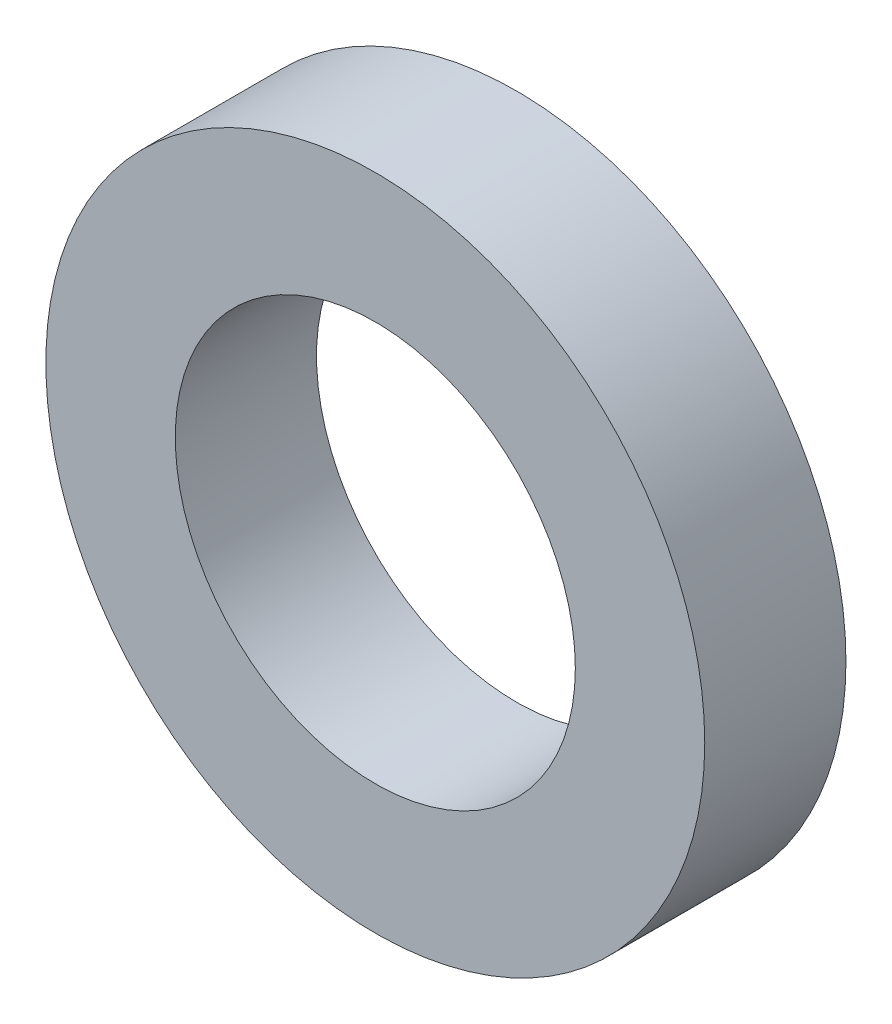
ISO-10303-21;
HEADER;
FILE_DESCRIPTION(('STEP AP214'),'2;1');
FILE_NAME('part.step','',(''),(''),'','','');
FILE_SCHEMA(('AUTOMOTIVE_DESIGN { 1 0 10303 214 1 1 1 1 }'));
ENDSEC;
DATA;
#1=APPLICATION_CONTEXT('core data for automotive mechanical design processes');
#2=APPLICATION_PROTOCOL_DEFINITION('international standard','automotive_design',2000,#1);
#3=PRODUCT_CONTEXT('',#1,'mechanical');
#4=PRODUCT('Part','Part','',(#3));
#5=PRODUCT_RELATED_PRODUCT_CATEGORY('part','',(#4));
#6=PRODUCT_DEFINITION_FORMATION('','',#4);
#7=PRODUCT_DEFINITION_CONTEXT('part definition',#1,'design');
#8=PRODUCT_DEFINITION('design','',#6,#7);
#9=PRODUCT_DEFINITION_SHAPE('','',#8);
#10=(LENGTH_UNIT() NAMED_UNIT(*) SI_UNIT(.MILLI.,.METRE.));
#11=(NAMED_UNIT(*) PLANE_ANGLE_UNIT() SI_UNIT($,.RADIAN.));
#12=(NAMED_UNIT(*) SI_UNIT($,.STERADIAN.) SOLID_ANGLE_UNIT());
#13=UNCERTAINTY_MEASURE_WITH_UNIT(LENGTH_MEASURE(1.E-05),#10,'distance_accuracy_value','');
#14=(GEOMETRIC_REPRESENTATION_CONTEXT(3) GLOBAL_UNCERTAINTY_ASSIGNED_CONTEXT((#13)) GLOBAL_UNIT_ASSIGNED_CONTEXT((#10,
#11,#12)) REPRESENTATION_CONTEXT('',''));
#15=CARTESIAN_POINT('',(0.,0.,0.));
#16=DIRECTION('',(0.,0.,1.));
#17=DIRECTION('',(1.,0.,0.));
#18=AXIS2_PLACEMENT_3D('',#15,#16,#17);
#19=CARTESIAN_POINT('',(0.,0.,3.));
#20=DIRECTION('',(0.,0.,1.));
#21=DIRECTION('',(1.,0.,0.));
#22=AXIS2_PLACEMENT_3D('',#19,#20,#21);
#23=PLANE('',#22);
#24=CARTESIAN_POINT('',(0.,0.,3.));
#25=DIRECTION('',(0.,0.,1.));
#26=DIRECTION('',(1.,0.,0.));
#27=AXIS2_PLACEMENT_3D('',#24,#25,#26);
#28=CIRCLE('',#27,7.);
#29=CARTESIAN_POINT('',(7.,0.,3.));
#30=VERTEX_POINT('',#29);
#31=EDGE_CURVE('E10',#30,#30,#28,.T.);
#32=ORIENTED_EDGE('',*,*,#31,.T.);
#33=EDGE_LOOP('',(#32));
#34=FACE_BOUND('',#33,.T.);
#35=CARTESIAN_POINT('',(0.,0.,3.));
#36=DIRECTION('',(0.,0.,1.));
#37=DIRECTION('',(1.,0.,0.));
#38=AXIS2_PLACEMENT_3D('',#35,#36,#37);
#39=CIRCLE('',#38,4.25);
#40=CARTESIAN_POINT('',(4.25,0.,3.));
#41=VERTEX_POINT('',#40);
#42=EDGE_CURVE('E42',#41,#41,#39,.T.);
#43=ORIENTED_EDGE('',*,*,#42,.F.);
#44=EDGE_LOOP('',(#43));
#45=FACE_BOUND('',#44,.T.);
#46=ADVANCED_FACE('F31',(#34,#45),#23,.T.);
#47=CARTESIAN_POINT('',(0.,0.,0.));
#48=DIRECTION('',(0.,0.,1.));
#49=DIRECTION('',(1.,0.,0.));
#50=AXIS2_PLACEMENT_3D('',#47,#48,#49);
#51=PLANE('',#50);
#52=CARTESIAN_POINT('',(0.,0.,0.));
#53=DIRECTION('',(0.,0.,1.));
#54=DIRECTION('',(1.,0.,0.));
#55=AXIS2_PLACEMENT_3D('',#52,#53,#54);
#56=CIRCLE('',#55,7.);
#57=CARTESIAN_POINT('',(7.,0.,0.));
#58=VERTEX_POINT('',#57);
#59=EDGE_CURVE('E35',#58,#58,#56,.T.);
#60=ORIENTED_EDGE('',*,*,#59,.F.);
#61=EDGE_LOOP('',(#60));
#62=FACE_BOUND('',#61,.T.);
#63=CARTESIAN_POINT('',(0.,0.,0.));
#64=DIRECTION('',(0.,0.,1.));
#65=DIRECTION('',(1.,0.,0.));
#66=AXIS2_PLACEMENT_3D('',#63,#64,#65);
#67=CIRCLE('',#66,4.25);
#68=CARTESIAN_POINT('',(4.25,0.,0.));
#69=VERTEX_POINT('',#68);
#70=EDGE_CURVE('E44',#69,#69,#67,.T.);
#71=ORIENTED_EDGE('',*,*,#70,.T.);
#72=EDGE_LOOP('',(#71));
#73=FACE_BOUND('',#72,.T.);
#74=ADVANCED_FACE('F54',(#62,#73),#51,.F.);
#75=CARTESIAN_POINT('',(0.,0.,3.));
#76=DIRECTION('',(0.,0.,-1.));
#77=DIRECTION('',(-1.,0.,0.));
#78=AXIS2_PLACEMENT_3D('',#75,#76,#77);
#79=CYLINDRICAL_SURFACE('',#78,7.);
#80=ORIENTED_EDGE('',*,*,#31,.F.);
#81=EDGE_LOOP('',(#80));
#82=FACE_BOUND('',#81,.T.);
#83=ORIENTED_EDGE('',*,*,#59,.T.);
#84=EDGE_LOOP('',(#83));
#85=FACE_BOUND('',#84,.T.);
#86=ADVANCED_FACE('F33',(#82,#85),#79,.T.);
#87=CARTESIAN_POINT('',(0.,0.,3.));
#88=DIRECTION('',(0.,0.,-1.));
#89=DIRECTION('',(-1.,0.,0.));
#90=AXIS2_PLACEMENT_3D('',#87,#88,#89);
#91=CYLINDRICAL_SURFACE('',#90,4.25);
#92=ORIENTED_EDGE('',*,*,#42,.T.);
#93=EDGE_LOOP('',(#92));
#94=FACE_BOUND('',#93,.T.);
#95=ORIENTED_EDGE('',*,*,#70,.F.);
#96=EDGE_LOOP('',(#95));
#97=FACE_BOUND('',#96,.T.);
#98=ADVANCED_FACE('F50',(#94,#97),#91,.F.);
#99=CLOSED_SHELL('',(#46,#74,#86,#98));
#100=MANIFOLD_SOLID_BREP('B2',#99);
#101=ADVANCED_BREP_SHAPE_REPRESENTATION('',(#18,#100),#14);
#102=SHAPE_DEFINITION_REPRESENTATION(#9,#101);
ENDSEC;
END-ISO-10303-21;
